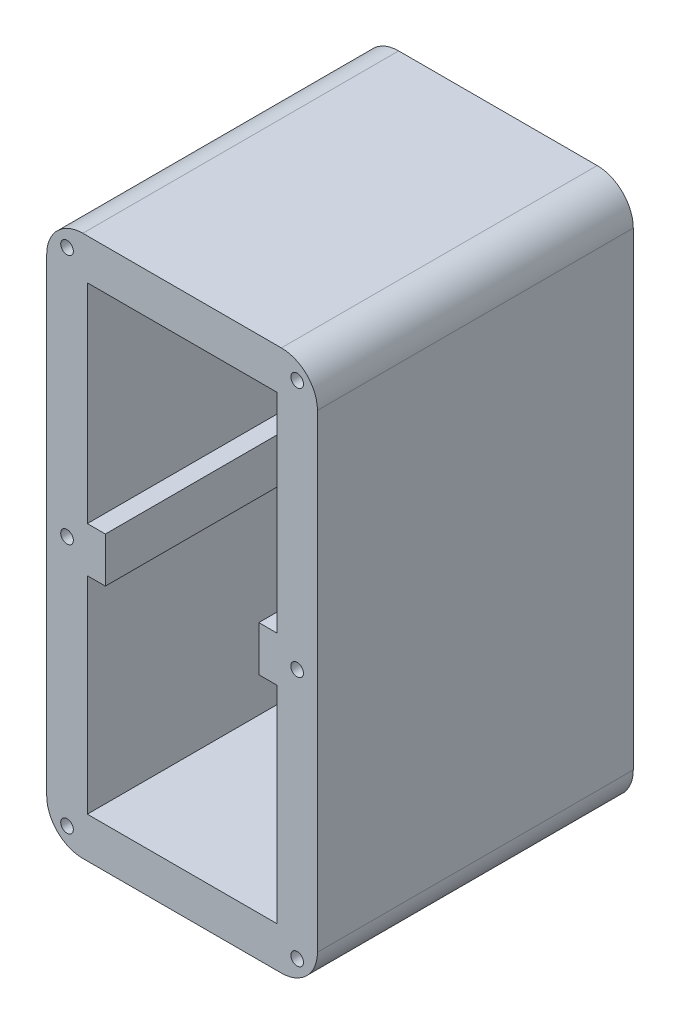
ISO-10303-21;
HEADER;
FILE_DESCRIPTION(('STEP AP214'),'2;1');
FILE_NAME('part.step','',(''),(''),'','','');
FILE_SCHEMA(('AUTOMOTIVE_DESIGN { 1 0 10303 214 1 1 1 1 }'));
ENDSEC;
DATA;
#1=APPLICATION_CONTEXT('core data for automotive mechanical design processes');
#2=APPLICATION_PROTOCOL_DEFINITION('international standard','automotive_design',2000,#1);
#3=PRODUCT_CONTEXT('',#1,'mechanical');
#4=PRODUCT('Part','Part','',(#3));
#5=PRODUCT_RELATED_PRODUCT_CATEGORY('part','',(#4));
#6=PRODUCT_DEFINITION_FORMATION('','',#4);
#7=PRODUCT_DEFINITION_CONTEXT('part definition',#1,'design');
#8=PRODUCT_DEFINITION('design','',#6,#7);
#9=PRODUCT_DEFINITION_SHAPE('','',#8);
#10=(LENGTH_UNIT() NAMED_UNIT(*) SI_UNIT(.MILLI.,.METRE.));
#11=(NAMED_UNIT(*) PLANE_ANGLE_UNIT() SI_UNIT($,.RADIAN.));
#12=(NAMED_UNIT(*) SI_UNIT($,.STERADIAN.) SOLID_ANGLE_UNIT());
#13=UNCERTAINTY_MEASURE_WITH_UNIT(LENGTH_MEASURE(1.E-05),#10,'distance_accuracy_value','');
#14=(GEOMETRIC_REPRESENTATION_CONTEXT(3) GLOBAL_UNCERTAINTY_ASSIGNED_CONTEXT((#13)) GLOBAL_UNIT_ASSIGNED_CONTEXT((#10,
#11,#12)) REPRESENTATION_CONTEXT('',''));
#15=CARTESIAN_POINT('',(0.,0.,0.));
#16=DIRECTION('',(0.,0.,1.));
#17=DIRECTION('',(1.,0.,0.));
#18=AXIS2_PLACEMENT_3D('',#15,#16,#17);
#19=CARTESIAN_POINT('',(-42.5,30.1067415730337,-70.));
#20=DIRECTION('',(0.,0.,1.));
#21=DIRECTION('',(1.,0.,0.));
#22=AXIS2_PLACEMENT_3D('',#19,#20,#21);
#23=CYLINDRICAL_SURFACE('',#22,1.4);
#24=CARTESIAN_POINT('',(-42.5,30.1067415730337,-70.));
#25=DIRECTION('',(0.,0.,1.));
#26=DIRECTION('',(1.,0.,0.));
#27=AXIS2_PLACEMENT_3D('',#24,#25,#26);
#28=CIRCLE('',#27,1.4);
#29=CARTESIAN_POINT('',(-41.1,30.1067415730337,-70.));
#30=VERTEX_POINT('',#29);
#31=EDGE_CURVE('E262',#30,#30,#28,.T.);
#32=ORIENTED_EDGE('',*,*,#31,.F.);
#33=EDGE_LOOP('',(#32));
#34=FACE_BOUND('',#33,.T.);
#35=CARTESIAN_POINT('',(-42.5,30.1067415730337,-62.));
#36=DIRECTION('',(0.,0.,1.));
#37=DIRECTION('',(1.,0.,0.));
#38=AXIS2_PLACEMENT_3D('',#35,#36,#37);
#39=CIRCLE('',#38,1.4);
#40=CARTESIAN_POINT('',(-41.1,30.1067415730337,-62.));
#41=VERTEX_POINT('',#40);
#42=EDGE_CURVE('E336',#41,#41,#39,.F.);
#43=ORIENTED_EDGE('',*,*,#42,.F.);
#44=EDGE_LOOP('',(#43));
#45=FACE_BOUND('',#44,.T.);
#46=ADVANCED_FACE('F39',(#34,#45),#23,.F.);
#47=CARTESIAN_POINT('',(8.50000000000001,30.1067415730337,-70.));
#48=DIRECTION('',(0.,0.,1.));
#49=DIRECTION('',(1.,0.,0.));
#50=AXIS2_PLACEMENT_3D('',#47,#48,#49);
#51=CYLINDRICAL_SURFACE('',#50,1.4);
#52=CARTESIAN_POINT('',(8.50000000000001,30.1067415730337,-70.));
#53=DIRECTION('',(0.,0.,1.));
#54=DIRECTION('',(1.,0.,0.));
#55=AXIS2_PLACEMENT_3D('',#52,#53,#54);
#56=CIRCLE('',#55,1.4);
#57=CARTESIAN_POINT('',(9.90000000000001,30.1067415730337,-70.));
#58=VERTEX_POINT('',#57);
#59=EDGE_CURVE('E265',#58,#58,#56,.T.);
#60=ORIENTED_EDGE('',*,*,#59,.F.);
#61=EDGE_LOOP('',(#60));
#62=FACE_BOUND('',#61,.T.);
#63=CARTESIAN_POINT('',(8.50000000000001,30.1067415730337,-62.));
#64=DIRECTION('',(0.,0.,1.));
#65=DIRECTION('',(1.,0.,0.));
#66=AXIS2_PLACEMENT_3D('',#63,#64,#65);
#67=CIRCLE('',#66,1.4);
#68=CARTESIAN_POINT('',(9.90000000000001,30.1067415730337,-62.));
#69=VERTEX_POINT('',#68);
#70=EDGE_CURVE('E333',#69,#69,#67,.F.);
#71=ORIENTED_EDGE('',*,*,#70,.F.);
#72=EDGE_LOOP('',(#71));
#73=FACE_BOUND('',#72,.T.);
#74=ADVANCED_FACE('F410',(#62,#73),#51,.F.);
#75=CARTESIAN_POINT('',(-42.5,-80.8932584269663,-70.));
#76=DIRECTION('',(0.,0.,1.));
#77=DIRECTION('',(1.,0.,0.));
#78=AXIS2_PLACEMENT_3D('',#75,#76,#77);
#79=CYLINDRICAL_SURFACE('',#78,1.4);
#80=CARTESIAN_POINT('',(-42.5,-80.8932584269663,-70.));
#81=DIRECTION('',(0.,0.,1.));
#82=DIRECTION('',(1.,0.,0.));
#83=AXIS2_PLACEMENT_3D('',#80,#81,#82);
#84=CIRCLE('',#83,1.4);
#85=CARTESIAN_POINT('',(-41.1,-80.8932584269663,-70.));
#86=VERTEX_POINT('',#85);
#87=EDGE_CURVE('E259',#86,#86,#84,.T.);
#88=ORIENTED_EDGE('',*,*,#87,.F.);
#89=EDGE_LOOP('',(#88));
#90=FACE_BOUND('',#89,.T.);
#91=CARTESIAN_POINT('',(-42.5,-80.8932584269663,-62.));
#92=DIRECTION('',(0.,0.,1.));
#93=DIRECTION('',(1.,0.,0.));
#94=AXIS2_PLACEMENT_3D('',#91,#92,#93);
#95=CIRCLE('',#94,1.4);
#96=CARTESIAN_POINT('',(-41.1,-80.8932584269663,-62.));
#97=VERTEX_POINT('',#96);
#98=EDGE_CURVE('E330',#97,#97,#95,.F.);
#99=ORIENTED_EDGE('',*,*,#98,.F.);
#100=EDGE_LOOP('',(#99));
#101=FACE_BOUND('',#100,.T.);
#102=ADVANCED_FACE('F416',(#90,#101),#79,.F.);
#103=CARTESIAN_POINT('',(8.50000000000002,-80.8932584269663,-70.));
#104=DIRECTION('',(0.,0.,1.));
#105=DIRECTION('',(1.,0.,0.));
#106=AXIS2_PLACEMENT_3D('',#103,#104,#105);
#107=CYLINDRICAL_SURFACE('',#106,1.4);
#108=CARTESIAN_POINT('',(8.50000000000002,-80.8932584269663,-70.));
#109=DIRECTION('',(0.,0.,1.));
#110=DIRECTION('',(1.,0.,0.));
#111=AXIS2_PLACEMENT_3D('',#108,#109,#110);
#112=CIRCLE('',#111,1.4);
#113=CARTESIAN_POINT('',(9.90000000000002,-80.8932584269663,-70.));
#114=VERTEX_POINT('',#113);
#115=EDGE_CURVE('E256',#114,#114,#112,.T.);
#116=ORIENTED_EDGE('',*,*,#115,.F.);
#117=EDGE_LOOP('',(#116));
#118=FACE_BOUND('',#117,.T.);
#119=CARTESIAN_POINT('',(8.50000000000002,-80.8932584269663,-62.));
#120=DIRECTION('',(0.,0.,1.));
#121=DIRECTION('',(1.,0.,0.));
#122=AXIS2_PLACEMENT_3D('',#119,#120,#121);
#123=CIRCLE('',#122,1.4);
#124=CARTESIAN_POINT('',(9.90000000000002,-80.8932584269663,-62.));
#125=VERTEX_POINT('',#124);
#126=EDGE_CURVE('E327',#125,#125,#123,.F.);
#127=ORIENTED_EDGE('',*,*,#126,.F.);
#128=EDGE_LOOP('',(#127));
#129=FACE_BOUND('',#128,.T.);
#130=ADVANCED_FACE('F425',(#118,#129),#107,.F.);
#131=CARTESIAN_POINT('',(-42.5,-25.3932584269663,-70.));
#132=DIRECTION('',(0.,0.,1.));
#133=DIRECTION('',(1.,0.,0.));
#134=AXIS2_PLACEMENT_3D('',#131,#132,#133);
#135=CYLINDRICAL_SURFACE('',#134,1.4);
#136=CARTESIAN_POINT('',(-42.5,-25.3932584269663,-70.));
#137=DIRECTION('',(0.,0.,1.));
#138=DIRECTION('',(1.,0.,0.));
#139=AXIS2_PLACEMENT_3D('',#136,#137,#138);
#140=CIRCLE('',#139,1.4);
#141=CARTESIAN_POINT('',(-41.1,-25.3932584269663,-70.));
#142=VERTEX_POINT('',#141);
#143=EDGE_CURVE('E252',#142,#142,#140,.T.);
#144=ORIENTED_EDGE('',*,*,#143,.F.);
#145=EDGE_LOOP('',(#144));
#146=FACE_BOUND('',#145,.T.);
#147=CARTESIAN_POINT('',(-42.5,-25.3932584269663,-62.));
#148=DIRECTION('',(0.,0.,1.));
#149=DIRECTION('',(1.,0.,0.));
#150=AXIS2_PLACEMENT_3D('',#147,#148,#149);
#151=CIRCLE('',#150,1.4);
#152=CARTESIAN_POINT('',(-41.1,-25.3932584269663,-62.));
#153=VERTEX_POINT('',#152);
#154=EDGE_CURVE('E324',#153,#153,#151,.F.);
#155=ORIENTED_EDGE('',*,*,#154,.F.);
#156=EDGE_LOOP('',(#155));
#157=FACE_BOUND('',#156,.T.);
#158=ADVANCED_FACE('F429',(#146,#157),#135,.F.);
#159=CARTESIAN_POINT('',(8.50000000000004,-25.3932584269663,-70.));
#160=DIRECTION('',(0.,0.,1.));
#161=DIRECTION('',(1.,0.,0.));
#162=AXIS2_PLACEMENT_3D('',#159,#160,#161);
#163=CYLINDRICAL_SURFACE('',#162,1.4);
#164=CARTESIAN_POINT('',(8.50000000000004,-25.3932584269663,-70.));
#165=DIRECTION('',(0.,0.,1.));
#166=DIRECTION('',(1.,0.,0.));
#167=AXIS2_PLACEMENT_3D('',#164,#165,#166);
#168=CIRCLE('',#167,1.4);
#169=CARTESIAN_POINT('',(9.90000000000004,-25.3932584269663,-70.));
#170=VERTEX_POINT('',#169);
#171=EDGE_CURVE('E249',#170,#170,#168,.T.);
#172=ORIENTED_EDGE('',*,*,#171,.F.);
#173=EDGE_LOOP('',(#172));
#174=FACE_BOUND('',#173,.T.);
#175=CARTESIAN_POINT('',(8.50000000000004,-25.3932584269663,-62.));
#176=DIRECTION('',(0.,0.,1.));
#177=DIRECTION('',(1.,0.,0.));
#178=AXIS2_PLACEMENT_3D('',#175,#176,#177);
#179=CIRCLE('',#178,1.4);
#180=CARTESIAN_POINT('',(9.90000000000004,-25.3932584269663,-62.));
#181=VERTEX_POINT('',#180);
#182=EDGE_CURVE('E314',#181,#181,#179,.F.);
#183=ORIENTED_EDGE('',*,*,#182,.F.);
#184=EDGE_LOOP('',(#183));
#185=FACE_BOUND('',#184,.T.);
#186=ADVANCED_FACE('F433',(#174,#185),#163,.F.);
#187=CARTESIAN_POINT('',(4.00000000000001,0.,-70.));
#188=DIRECTION('',(1.,0.,0.));
#189=DIRECTION('',(0.,1.,0.));
#190=AXIS2_PLACEMENT_3D('',#187,#188,#189);
#191=PLANE('',#190);
#192=DIRECTION('',(0.,0.,1.));
#193=VECTOR('',#192,1.);
#194=CARTESIAN_POINT('',(4.00000000000001,-20.6188515219815,-60.));
#195=LINE('',#194,#193);
#196=CARTESIAN_POINT('',(4.00000000000001,-20.6188515219815,-60.));
#197=VERTEX_POINT('',#196);
#198=CARTESIAN_POINT('',(4.00000000000001,-20.6188515219815,0.));
#199=VERTEX_POINT('',#198);
#200=EDGE_CURVE('E195',#197,#199,#195,.T.);
#201=ORIENTED_EDGE('',*,*,#200,.T.);
#202=DIRECTION('',(0.,1.,0.));
#203=VECTOR('',#202,1.);
#204=CARTESIAN_POINT('',(4.00000000000001,0.,0.));
#205=LINE('',#204,#203);
#206=CARTESIAN_POINT('',(4.00000000000001,25.6067415730337,0.));
#207=VERTEX_POINT('',#206);
#208=EDGE_CURVE('E240',#199,#207,#205,.T.);
#209=ORIENTED_EDGE('',*,*,#208,.T.);
#210=DIRECTION('',(0.,0.,1.));
#211=VECTOR('',#210,1.);
#212=CARTESIAN_POINT('',(4.00000000000001,25.6067415730337,-70.));
#213=LINE('',#212,#211);
#214=CARTESIAN_POINT('',(4.00000000000001,25.6067415730337,-70.));
#215=VERTEX_POINT('',#214);
#216=EDGE_CURVE('E311',#215,#207,#213,.T.);
#217=ORIENTED_EDGE('',*,*,#216,.F.);
#218=DIRECTION('',(0.,1.,0.));
#219=VECTOR('',#218,1.);
#220=CARTESIAN_POINT('',(4.00000000000001,0.,-70.));
#221=LINE('',#220,#219);
#222=CARTESIAN_POINT('',(4.,-76.3932584269663,-70.));
#223=VERTEX_POINT('',#222);
#224=EDGE_CURVE('E268',#223,#215,#221,.T.);
#225=ORIENTED_EDGE('',*,*,#224,.F.);
#226=DIRECTION('',(0.,0.,1.));
#227=VECTOR('',#226,1.);
#228=CARTESIAN_POINT('',(4.,-76.3932584269663,-70.));
#229=LINE('',#228,#227);
#230=CARTESIAN_POINT('',(4.,-76.3932584269663,0.));
#231=VERTEX_POINT('',#230);
#232=EDGE_CURVE('E289',#223,#231,#229,.T.);
#233=ORIENTED_EDGE('',*,*,#232,.T.);
#234=CARTESIAN_POINT('',(4.00000000000001,-30.6188515219816,0.));
#235=VERTEX_POINT('',#234);
#236=EDGE_CURVE('E290',#231,#235,#205,.T.);
#237=ORIENTED_EDGE('',*,*,#236,.T.);
#238=DIRECTION('',(0.,0.,1.));
#239=VECTOR('',#238,1.);
#240=CARTESIAN_POINT('',(4.00000000000001,-30.6188515219816,-60.));
#241=LINE('',#240,#239);
#242=CARTESIAN_POINT('',(4.00000000000001,-30.6188515219816,-60.));
#243=VERTEX_POINT('',#242);
#244=EDGE_CURVE('E217',#243,#235,#241,.T.);
#245=ORIENTED_EDGE('',*,*,#244,.F.);
#246=DIRECTION('',(0.,1.,0.));
#247=VECTOR('',#246,1.);
#248=CARTESIAN_POINT('',(4.00000000000001,0.,-60.));
#249=LINE('',#248,#247);
#250=EDGE_CURVE('E188',#243,#197,#249,.T.);
#251=ORIENTED_EDGE('',*,*,#250,.T.);
#252=EDGE_LOOP('',(#201,#209,#217,#225,#233,#237,#245,#251));
#253=FACE_BOUND('',#252,.T.);
#254=ADVANCED_FACE('F436',(#253),#191,.F.);
#255=CARTESIAN_POINT('',(13.,0.,-70.));
#256=DIRECTION('',(-1.,0.,0.));
#257=DIRECTION('',(0.,-1.,0.));
#258=AXIS2_PLACEMENT_3D('',#255,#256,#257);
#259=PLANE('',#258);
#260=DIRECTION('',(0.,-1.,0.));
#261=VECTOR('',#260,1.);
#262=CARTESIAN_POINT('',(13.,0.,0.));
#263=LINE('',#262,#261);
#264=CARTESIAN_POINT('',(13.,26.6067415730337,0.));
#265=VERTEX_POINT('',#264);
#266=CARTESIAN_POINT('',(13.,-77.3932584269663,0.));
#267=VERTEX_POINT('',#266);
#268=EDGE_CURVE('E301',#265,#267,#263,.T.);
#269=ORIENTED_EDGE('',*,*,#268,.T.);
#270=DIRECTION('',(0.,0.,1.));
#271=VECTOR('',#270,1.);
#272=CARTESIAN_POINT('',(13.,-77.3932584269663,-70.));
#273=LINE('',#272,#271);
#274=CARTESIAN_POINT('',(13.,-77.3932584269663,-70.));
#275=VERTEX_POINT('',#274);
#276=EDGE_CURVE('E355',#267,#275,#273,.F.);
#277=ORIENTED_EDGE('',*,*,#276,.T.);
#278=DIRECTION('',(0.,-1.,0.));
#279=VECTOR('',#278,1.);
#280=CARTESIAN_POINT('',(13.,0.,-70.));
#281=LINE('',#280,#279);
#282=CARTESIAN_POINT('',(13.,26.6067415730337,-70.));
#283=VERTEX_POINT('',#282);
#284=EDGE_CURVE('E278',#283,#275,#281,.T.);
#285=ORIENTED_EDGE('',*,*,#284,.F.);
#286=DIRECTION('',(0.,0.,1.));
#287=VECTOR('',#286,1.);
#288=CARTESIAN_POINT('',(13.,26.6067415730337,-70.));
#289=LINE('',#288,#287);
#290=EDGE_CURVE('E352',#283,#265,#289,.T.);
#291=ORIENTED_EDGE('',*,*,#290,.T.);
#292=EDGE_LOOP('',(#269,#277,#285,#291));
#293=FACE_BOUND('',#292,.T.);
#294=ADVANCED_FACE('F390',(#293),#259,.F.);
#295=CARTESIAN_POINT('',(0.,-85.3932584269663,-70.));
#296=DIRECTION('',(0.,-1.,0.));
#297=DIRECTION('',(0.,0.,-1.));
#298=AXIS2_PLACEMENT_3D('',#295,#296,#297);
#299=PLANE('',#298);
#300=DIRECTION('',(1.,0.,0.));
#301=VECTOR('',#300,1.);
#302=CARTESIAN_POINT('',(0.,-85.3932584269663,-70.));
#303=LINE('',#302,#301);
#304=CARTESIAN_POINT('',(-39.,-85.3932584269663,-70.));
#305=VERTEX_POINT('',#304);
#306=CARTESIAN_POINT('',(5.00000000000002,-85.3932584269663,-70.));
#307=VERTEX_POINT('',#306);
#308=EDGE_CURVE('E286',#305,#307,#303,.T.);
#309=ORIENTED_EDGE('',*,*,#308,.T.);
#310=DIRECTION('',(0.,0.,1.));
#311=VECTOR('',#310,1.);
#312=CARTESIAN_POINT('',(5.00000000000002,-85.3932584269663,0.));
#313=LINE('',#312,#311);
#314=CARTESIAN_POINT('',(5.00000000000002,-85.3932584269663,0.));
#315=VERTEX_POINT('',#314);
#316=EDGE_CURVE('E341',#307,#315,#313,.T.);
#317=ORIENTED_EDGE('',*,*,#316,.T.);
#318=DIRECTION('',(1.,0.,0.));
#319=VECTOR('',#318,1.);
#320=CARTESIAN_POINT('',(0.,-85.3932584269663,0.));
#321=LINE('',#320,#319);
#322=CARTESIAN_POINT('',(-39.,-85.3932584269663,0.));
#323=VERTEX_POINT('',#322);
#324=EDGE_CURVE('E253',#323,#315,#321,.T.);
#325=ORIENTED_EDGE('',*,*,#324,.F.);
#326=DIRECTION('',(0.,0.,1.));
#327=VECTOR('',#326,1.);
#328=CARTESIAN_POINT('',(-39.,-85.3932584269663,-70.));
#329=LINE('',#328,#327);
#330=EDGE_CURVE('E339',#323,#305,#329,.F.);
#331=ORIENTED_EDGE('',*,*,#330,.T.);
#332=EDGE_LOOP('',(#309,#317,#325,#331));
#333=FACE_BOUND('',#332,.T.);
#334=ADVANCED_FACE('F397',(#333),#299,.T.);
#335=CARTESIAN_POINT('',(-47.,0.,-70.));
#336=DIRECTION('',(-1.,0.,0.));
#337=DIRECTION('',(0.,-1.,0.));
#338=AXIS2_PLACEMENT_3D('',#335,#336,#337);
#339=PLANE('',#338);
#340=DIRECTION('',(0.,-1.,0.));
#341=VECTOR('',#340,1.);
#342=CARTESIAN_POINT('',(-47.,0.,-70.));
#343=LINE('',#342,#341);
#344=CARTESIAN_POINT('',(-47.,26.6067415730337,-70.));
#345=VERTEX_POINT('',#344);
#346=CARTESIAN_POINT('',(-47.,-77.3932584269663,-70.));
#347=VERTEX_POINT('',#346);
#348=EDGE_CURVE('E283',#345,#347,#343,.T.);
#349=ORIENTED_EDGE('',*,*,#348,.T.);
#350=DIRECTION('',(0.,0.,1.));
#351=VECTOR('',#350,1.);
#352=CARTESIAN_POINT('',(-47.,-77.3932584269663,-70.));
#353=LINE('',#352,#351);
#354=CARTESIAN_POINT('',(-47.,-77.3932584269663,0.));
#355=VERTEX_POINT('',#354);
#356=EDGE_CURVE('E366',#347,#355,#353,.T.);
#357=ORIENTED_EDGE('',*,*,#356,.T.);
#358=DIRECTION('',(0.,-1.,0.));
#359=VECTOR('',#358,1.);
#360=CARTESIAN_POINT('',(-47.,0.,0.));
#361=LINE('',#360,#359);
#362=CARTESIAN_POINT('',(-47.,26.6067415730337,0.));
#363=VERTEX_POINT('',#362);
#364=EDGE_CURVE('E306',#363,#355,#361,.T.);
#365=ORIENTED_EDGE('',*,*,#364,.F.);
#366=DIRECTION('',(0.,0.,1.));
#367=VECTOR('',#366,1.);
#368=CARTESIAN_POINT('',(-47.,26.6067415730337,-70.));
#369=LINE('',#368,#367);
#370=EDGE_CURVE('E364',#363,#345,#369,.F.);
#371=ORIENTED_EDGE('',*,*,#370,.T.);
#372=EDGE_LOOP('',(#349,#357,#365,#371));
#373=FACE_BOUND('',#372,.T.);
#374=ADVANCED_FACE('F371',(#373),#339,.T.);
#375=CARTESIAN_POINT('',(0.,25.6067415730337,-70.));
#376=DIRECTION('',(0.,-1.,0.));
#377=DIRECTION('',(0.,0.,-1.));
#378=AXIS2_PLACEMENT_3D('',#375,#376,#377);
#379=PLANE('',#378);
#380=DIRECTION('',(1.,0.,0.));
#381=VECTOR('',#380,1.);
#382=CARTESIAN_POINT('',(0.,25.6067415730337,0.));
#383=LINE('',#382,#381);
#384=CARTESIAN_POINT('',(-38.,25.6067415730337,0.));
#385=VERTEX_POINT('',#384);
#386=EDGE_CURVE('E298',#385,#207,#383,.T.);
#387=ORIENTED_EDGE('',*,*,#386,.F.);
#388=DIRECTION('',(0.,0.,1.));
#389=VECTOR('',#388,1.);
#390=CARTESIAN_POINT('',(-38.,25.6067415730337,-70.));
#391=LINE('',#390,#389);
#392=CARTESIAN_POINT('',(-38.,25.6067415730337,-70.));
#393=VERTEX_POINT('',#392);
#394=EDGE_CURVE('E315',#393,#385,#391,.T.);
#395=ORIENTED_EDGE('',*,*,#394,.F.);
#396=DIRECTION('',(1.,0.,0.));
#397=VECTOR('',#396,1.);
#398=CARTESIAN_POINT('',(0.,25.6067415730337,-70.));
#399=LINE('',#398,#397);
#400=EDGE_CURVE('E275',#393,#215,#399,.T.);
#401=ORIENTED_EDGE('',*,*,#400,.T.);
#402=ORIENTED_EDGE('',*,*,#216,.T.);
#403=EDGE_LOOP('',(#387,#395,#401,#402));
#404=FACE_BOUND('',#403,.T.);
#405=ADVANCED_FACE('F494',(#404),#379,.T.);
#406=CARTESIAN_POINT('',(-38.,0.,-70.));
#407=DIRECTION('',(1.,0.,0.));
#408=DIRECTION('',(0.,0.,-1.));
#409=AXIS2_PLACEMENT_3D('',#406,#407,#408);
#410=PLANE('',#409);
#411=DIRECTION('',(0.,0.,1.));
#412=VECTOR('',#411,1.);
#413=CARTESIAN_POINT('',(-38.,-30.6188515219816,-60.));
#414=LINE('',#413,#412);
#415=CARTESIAN_POINT('',(-38.,-30.6188515219816,-60.));
#416=VERTEX_POINT('',#415);
#417=CARTESIAN_POINT('',(-38.,-30.6188515219816,0.));
#418=VERTEX_POINT('',#417);
#419=EDGE_CURVE('E241',#416,#418,#414,.T.);
#420=ORIENTED_EDGE('',*,*,#419,.T.);
#421=DIRECTION('',(0.,1.,0.));
#422=VECTOR('',#421,1.);
#423=CARTESIAN_POINT('',(-38.,0.,0.));
#424=LINE('',#423,#422);
#425=CARTESIAN_POINT('',(-38.,-76.3932584269663,0.));
#426=VERTEX_POINT('',#425);
#427=EDGE_CURVE('E295',#426,#418,#424,.T.);
#428=ORIENTED_EDGE('',*,*,#427,.F.);
#429=DIRECTION('',(0.,0.,1.));
#430=VECTOR('',#429,1.);
#431=CARTESIAN_POINT('',(-38.,-76.3932584269663,-70.));
#432=LINE('',#431,#430);
#433=CARTESIAN_POINT('',(-38.,-76.3932584269663,-70.));
#434=VERTEX_POINT('',#433);
#435=EDGE_CURVE('E318',#434,#426,#432,.T.);
#436=ORIENTED_EDGE('',*,*,#435,.F.);
#437=DIRECTION('',(0.,1.,0.));
#438=VECTOR('',#437,1.);
#439=CARTESIAN_POINT('',(-38.,0.,-70.));
#440=LINE('',#439,#438);
#441=EDGE_CURVE('E272',#434,#393,#440,.T.);
#442=ORIENTED_EDGE('',*,*,#441,.T.);
#443=ORIENTED_EDGE('',*,*,#394,.T.);
#444=CARTESIAN_POINT('',(-38.,-20.6188515219816,0.));
#445=VERTEX_POINT('',#444);
#446=EDGE_CURVE('E294',#445,#385,#424,.T.);
#447=ORIENTED_EDGE('',*,*,#446,.F.);
#448=DIRECTION('',(0.,0.,1.));
#449=VECTOR('',#448,1.);
#450=CARTESIAN_POINT('',(-38.,-20.6188515219816,-60.));
#451=LINE('',#450,#449);
#452=CARTESIAN_POINT('',(-38.,-20.6188515219816,-60.));
#453=VERTEX_POINT('',#452);
#454=EDGE_CURVE('E244',#453,#445,#451,.T.);
#455=ORIENTED_EDGE('',*,*,#454,.F.);
#456=DIRECTION('',(0.,1.,0.));
#457=VECTOR('',#456,1.);
#458=CARTESIAN_POINT('',(-38.,0.,-60.));
#459=LINE('',#458,#457);
#460=EDGE_CURVE('E226',#416,#453,#459,.T.);
#461=ORIENTED_EDGE('',*,*,#460,.F.);
#462=EDGE_LOOP('',(#420,#428,#436,#442,#443,#447,#455,#461));
#463=FACE_BOUND('',#462,.T.);
#464=ADVANCED_FACE('F502',(#463),#410,.T.);
#465=CARTESIAN_POINT('',(0.,-76.3932584269663,-70.));
#466=DIRECTION('',(0.,-1.,0.));
#467=DIRECTION('',(0.,0.,-1.));
#468=AXIS2_PLACEMENT_3D('',#465,#466,#467);
#469=PLANE('',#468);
#470=DIRECTION('',(1.,0.,0.));
#471=VECTOR('',#470,1.);
#472=CARTESIAN_POINT('',(0.,-76.3932584269663,0.));
#473=LINE('',#472,#471);
#474=EDGE_CURVE('E292',#426,#231,#473,.T.);
#475=ORIENTED_EDGE('',*,*,#474,.T.);
#476=ORIENTED_EDGE('',*,*,#232,.F.);
#477=DIRECTION('',(1.,0.,0.));
#478=VECTOR('',#477,1.);
#479=CARTESIAN_POINT('',(0.,-76.3932584269663,-70.));
#480=LINE('',#479,#478);
#481=EDGE_CURVE('E270',#434,#223,#480,.T.);
#482=ORIENTED_EDGE('',*,*,#481,.F.);
#483=ORIENTED_EDGE('',*,*,#435,.T.);
#484=EDGE_LOOP('',(#475,#476,#482,#483));
#485=FACE_BOUND('',#484,.T.);
#486=ADVANCED_FACE('F497',(#485),#469,.F.);
#487=CARTESIAN_POINT('',(0.,34.6067415730337,-70.));
#488=DIRECTION('',(0.,-1.,0.));
#489=DIRECTION('',(1.,0.,0.));
#490=AXIS2_PLACEMENT_3D('',#487,#488,#489);
#491=PLANE('',#490);
#492=DIRECTION('',(1.,0.,0.));
#493=VECTOR('',#492,1.);
#494=CARTESIAN_POINT('',(0.,34.6067415730337,-70.));
#495=LINE('',#494,#493);
#496=CARTESIAN_POINT('',(-39.,34.6067415730337,-70.));
#497=VERTEX_POINT('',#496);
#498=CARTESIAN_POINT('',(5.00000000000001,34.6067415730337,-70.));
#499=VERTEX_POINT('',#498);
#500=EDGE_CURVE('E281',#497,#499,#495,.T.);
#501=ORIENTED_EDGE('',*,*,#500,.F.);
#502=DIRECTION('',(0.,0.,1.));
#503=VECTOR('',#502,1.);
#504=CARTESIAN_POINT('',(-39.,34.6067415730337,0.));
#505=LINE('',#504,#503);
#506=CARTESIAN_POINT('',(-39.,34.6067415730337,0.));
#507=VERTEX_POINT('',#506);
#508=EDGE_CURVE('E11',#497,#507,#505,.T.);
#509=ORIENTED_EDGE('',*,*,#508,.T.);
#510=DIRECTION('',(1.,0.,0.));
#511=VECTOR('',#510,1.);
#512=CARTESIAN_POINT('',(0.,34.6067415730337,0.));
#513=LINE('',#512,#511);
#514=CARTESIAN_POINT('',(5.00000000000001,34.6067415730337,0.));
#515=VERTEX_POINT('',#514);
#516=EDGE_CURVE('E304',#507,#515,#513,.T.);
#517=ORIENTED_EDGE('',*,*,#516,.T.);
#518=DIRECTION('',(0.,0.,1.));
#519=VECTOR('',#518,1.);
#520=CARTESIAN_POINT('',(5.00000000000001,34.6067415730337,-70.));
#521=LINE('',#520,#519);
#522=EDGE_CURVE('E47',#515,#499,#521,.F.);
#523=ORIENTED_EDGE('',*,*,#522,.T.);
#524=EDGE_LOOP('',(#501,#509,#517,#523));
#525=FACE_BOUND('',#524,.T.);
#526=ADVANCED_FACE('F382',(#525),#491,.F.);
#527=CARTESIAN_POINT('',(0.,0.,-70.));
#528=DIRECTION('',(0.,0.,1.));
#529=DIRECTION('',(1.,0.,0.));
#530=AXIS2_PLACEMENT_3D('',#527,#528,#529);
#531=PLANE('',#530);
#532=ORIENTED_EDGE('',*,*,#171,.T.);
#533=EDGE_LOOP('',(#532));
#534=FACE_BOUND('',#533,.T.);
#535=ORIENTED_EDGE('',*,*,#143,.T.);
#536=EDGE_LOOP('',(#535));
#537=FACE_BOUND('',#536,.T.);
#538=ORIENTED_EDGE('',*,*,#115,.T.);
#539=EDGE_LOOP('',(#538));
#540=FACE_BOUND('',#539,.T.);
#541=ORIENTED_EDGE('',*,*,#87,.T.);
#542=EDGE_LOOP('',(#541));
#543=FACE_BOUND('',#542,.T.);
#544=ORIENTED_EDGE('',*,*,#31,.T.);
#545=EDGE_LOOP('',(#544));
#546=FACE_BOUND('',#545,.T.);
#547=ORIENTED_EDGE('',*,*,#59,.T.);
#548=EDGE_LOOP('',(#547));
#549=FACE_BOUND('',#548,.T.);
#550=ORIENTED_EDGE('',*,*,#224,.T.);
#551=ORIENTED_EDGE('',*,*,#400,.F.);
#552=ORIENTED_EDGE('',*,*,#441,.F.);
#553=ORIENTED_EDGE('',*,*,#481,.T.);
#554=EDGE_LOOP('',(#550,#551,#552,#553));
#555=FACE_BOUND('',#554,.T.);
#556=ORIENTED_EDGE('',*,*,#284,.T.);
#557=CARTESIAN_POINT('',(5.00000000000002,-77.3932584269663,-70.));
#558=DIRECTION('',(0.,0.,1.));
#559=DIRECTION('',(1.,0.,0.));
#560=AXIS2_PLACEMENT_3D('',#557,#558,#559);
#561=CIRCLE('',#560,8.);
#562=EDGE_CURVE('E362',#275,#307,#561,.F.);
#563=ORIENTED_EDGE('',*,*,#562,.T.);
#564=ORIENTED_EDGE('',*,*,#308,.F.);
#565=CARTESIAN_POINT('',(-39.,-77.3932584269663,-70.));
#566=DIRECTION('',(0.,0.,1.));
#567=DIRECTION('',(1.,0.,0.));
#568=AXIS2_PLACEMENT_3D('',#565,#566,#567);
#569=CIRCLE('',#568,8.);
#570=EDGE_CURVE('E360',#305,#347,#569,.F.);
#571=ORIENTED_EDGE('',*,*,#570,.T.);
#572=ORIENTED_EDGE('',*,*,#348,.F.);
#573=CARTESIAN_POINT('',(-39.,26.6067415730337,-70.));
#574=DIRECTION('',(0.,0.,1.));
#575=DIRECTION('',(1.,0.,0.));
#576=AXIS2_PLACEMENT_3D('',#573,#574,#575);
#577=CIRCLE('',#576,8.);
#578=EDGE_CURVE('E60',#345,#497,#577,.F.);
#579=ORIENTED_EDGE('',*,*,#578,.T.);
#580=ORIENTED_EDGE('',*,*,#500,.T.);
#581=CARTESIAN_POINT('',(5.00000000000001,26.6067415730337,-70.));
#582=DIRECTION('',(0.,0.,1.));
#583=DIRECTION('',(1.,0.,0.));
#584=AXIS2_PLACEMENT_3D('',#581,#582,#583);
#585=CIRCLE('',#584,8.);
#586=EDGE_CURVE('E357',#499,#283,#585,.F.);
#587=ORIENTED_EDGE('',*,*,#586,.T.);
#588=EDGE_LOOP('',(#556,#563,#564,#571,#572,#579,#580,#587));
#589=FACE_BOUND('',#588,.T.);
#590=ADVANCED_FACE('F384',(#534,#537,#540,#543,#546,#549,#555,#589),#531,.F.);
#591=CARTESIAN_POINT('',(0.,0.,0.));
#592=DIRECTION('',(0.,0.,1.));
#593=DIRECTION('',(1.,0.,0.));
#594=AXIS2_PLACEMENT_3D('',#591,#592,#593);
#595=PLANE('',#594);
#596=CARTESIAN_POINT('',(8.50000000000002,-80.8932584269663,0.));
#597=DIRECTION('',(0.,0.,1.));
#598=DIRECTION('',(1.,0.,0.));
#599=AXIS2_PLACEMENT_3D('',#596,#597,#598);
#600=CIRCLE('',#599,1.4);
#601=CARTESIAN_POINT('',(9.90000000000002,-80.8932584269663,0.));
#602=VERTEX_POINT('',#601);
#603=EDGE_CURVE('E980',#602,#602,#600,.T.);
#604=ORIENTED_EDGE('',*,*,#603,.F.);
#605=EDGE_LOOP('',(#604));
#606=FACE_BOUND('',#605,.T.);
#607=CARTESIAN_POINT('',(-42.5,30.1067415730337,0.));
#608=DIRECTION('',(0.,0.,1.));
#609=DIRECTION('',(1.,0.,0.));
#610=AXIS2_PLACEMENT_3D('',#607,#608,#609);
#611=CIRCLE('',#610,1.4);
#612=CARTESIAN_POINT('',(-41.1,30.1067415730337,0.));
#613=VERTEX_POINT('',#612);
#614=EDGE_CURVE('E1004',#613,#613,#611,.T.);
#615=ORIENTED_EDGE('',*,*,#614,.F.);
#616=EDGE_LOOP('',(#615));
#617=FACE_BOUND('',#616,.T.);
#618=CARTESIAN_POINT('',(8.50000000000001,30.1067415730337,0.));
#619=DIRECTION('',(0.,0.,1.));
#620=DIRECTION('',(1.,0.,0.));
#621=AXIS2_PLACEMENT_3D('',#618,#619,#620);
#622=CIRCLE('',#621,1.4);
#623=CARTESIAN_POINT('',(9.90000000000001,30.1067415730337,0.));
#624=VERTEX_POINT('',#623);
#625=EDGE_CURVE('E998',#624,#624,#622,.T.);
#626=ORIENTED_EDGE('',*,*,#625,.F.);
#627=EDGE_LOOP('',(#626));
#628=FACE_BOUND('',#627,.T.);
#629=CARTESIAN_POINT('',(8.50000000000004,-25.3932584269663,0.));
#630=DIRECTION('',(0.,0.,1.));
#631=DIRECTION('',(1.,0.,0.));
#632=AXIS2_PLACEMENT_3D('',#629,#630,#631);
#633=CIRCLE('',#632,1.4);
#634=CARTESIAN_POINT('',(9.90000000000004,-25.3932584269663,0.));
#635=VERTEX_POINT('',#634);
#636=EDGE_CURVE('E991',#635,#635,#633,.T.);
#637=ORIENTED_EDGE('',*,*,#636,.F.);
#638=EDGE_LOOP('',(#637));
#639=FACE_BOUND('',#638,.T.);
#640=CARTESIAN_POINT('',(-42.5,-80.8932584269663,0.));
#641=DIRECTION('',(0.,0.,1.));
#642=DIRECTION('',(1.,0.,0.));
#643=AXIS2_PLACEMENT_3D('',#640,#641,#642);
#644=CIRCLE('',#643,1.4);
#645=CARTESIAN_POINT('',(-41.1,-80.8932584269663,0.));
#646=VERTEX_POINT('',#645);
#647=EDGE_CURVE('E981',#646,#646,#644,.T.);
#648=ORIENTED_EDGE('',*,*,#647,.F.);
#649=EDGE_LOOP('',(#648));
#650=FACE_BOUND('',#649,.T.);
#651=CARTESIAN_POINT('',(-42.5,-25.3932584269663,0.));
#652=DIRECTION('',(0.,0.,1.));
#653=DIRECTION('',(1.,0.,0.));
#654=AXIS2_PLACEMENT_3D('',#651,#652,#653);
#655=CIRCLE('',#654,1.4);
#656=CARTESIAN_POINT('',(-41.1,-25.3932584269663,0.));
#657=VERTEX_POINT('',#656);
#658=EDGE_CURVE('E994',#657,#657,#655,.T.);
#659=ORIENTED_EDGE('',*,*,#658,.F.);
#660=EDGE_LOOP('',(#659));
#661=FACE_BOUND('',#660,.T.);
#662=ORIENTED_EDGE('',*,*,#236,.F.);
#663=ORIENTED_EDGE('',*,*,#474,.F.);
#664=ORIENTED_EDGE('',*,*,#427,.T.);
#665=DIRECTION('',(1.,0.,0.));
#666=VECTOR('',#665,1.);
#667=CARTESIAN_POINT('',(0.,-30.6188515219816,0.));
#668=LINE('',#667,#666);
#669=CARTESIAN_POINT('',(-34.,-30.6188515219816,0.));
#670=VERTEX_POINT('',#669);
#671=EDGE_CURVE('E224',#418,#670,#668,.T.);
#672=ORIENTED_EDGE('',*,*,#671,.T.);
#673=DIRECTION('',(0.,-1.,0.));
#674=VECTOR('',#673,1.);
#675=CARTESIAN_POINT('',(-34.,0.,0.));
#676=LINE('',#675,#674);
#677=CARTESIAN_POINT('',(-34.,-20.6188515219816,0.));
#678=VERTEX_POINT('',#677);
#679=EDGE_CURVE('E216',#678,#670,#676,.T.);
#680=ORIENTED_EDGE('',*,*,#679,.F.);
#681=DIRECTION('',(1.,0.,0.));
#682=VECTOR('',#681,1.);
#683=CARTESIAN_POINT('',(0.,-20.6188515219816,0.));
#684=LINE('',#683,#682);
#685=EDGE_CURVE('E234',#445,#678,#684,.T.);
#686=ORIENTED_EDGE('',*,*,#685,.F.);
#687=ORIENTED_EDGE('',*,*,#446,.T.);
#688=ORIENTED_EDGE('',*,*,#386,.T.);
#689=ORIENTED_EDGE('',*,*,#208,.F.);
#690=DIRECTION('',(1.,0.,0.));
#691=VECTOR('',#690,1.);
#692=CARTESIAN_POINT('',(0.,-20.6188515219815,0.));
#693=LINE('',#692,#691);
#694=CARTESIAN_POINT('',(0.,-20.6188515219815,0.));
#695=VERTEX_POINT('',#694);
#696=EDGE_CURVE('E209',#695,#199,#693,.T.);
#697=ORIENTED_EDGE('',*,*,#696,.F.);
#698=DIRECTION('',(0.,-1.,0.));
#699=VECTOR('',#698,1.);
#700=CARTESIAN_POINT('',(0.,0.,0.));
#701=LINE('',#700,#699);
#702=CARTESIAN_POINT('',(0.,-30.6188515219815,0.));
#703=VERTEX_POINT('',#702);
#704=EDGE_CURVE('E183',#695,#703,#701,.T.);
#705=ORIENTED_EDGE('',*,*,#704,.T.);
#706=DIRECTION('',(1.,0.,0.));
#707=VECTOR('',#706,1.);
#708=CARTESIAN_POINT('',(-1.06230481085259E-13,-30.6188515219815,0.));
#709=LINE('',#708,#707);
#710=EDGE_CURVE('E198',#703,#235,#709,.T.);
#711=ORIENTED_EDGE('',*,*,#710,.T.);
#712=EDGE_LOOP('',(#662,#663,#664,#672,#680,#686,#687,#688,#689,#697,#705,#711));
#713=FACE_BOUND('',#712,.T.);
#714=ORIENTED_EDGE('',*,*,#324,.T.);
#715=CARTESIAN_POINT('',(5.00000000000002,-77.3932584269663,0.));
#716=DIRECTION('',(0.,0.,1.));
#717=DIRECTION('',(1.,0.,0.));
#718=AXIS2_PLACEMENT_3D('',#715,#716,#717);
#719=CIRCLE('',#718,8.);
#720=EDGE_CURVE('E350',#315,#267,#719,.T.);
#721=ORIENTED_EDGE('',*,*,#720,.T.);
#722=ORIENTED_EDGE('',*,*,#268,.F.);
#723=CARTESIAN_POINT('',(5.00000000000001,26.6067415730337,0.));
#724=DIRECTION('',(0.,0.,1.));
#725=DIRECTION('',(1.,0.,0.));
#726=AXIS2_PLACEMENT_3D('',#723,#724,#725);
#727=CIRCLE('',#726,8.);
#728=EDGE_CURVE('E344',#265,#515,#727,.T.);
#729=ORIENTED_EDGE('',*,*,#728,.T.);
#730=ORIENTED_EDGE('',*,*,#516,.F.);
#731=CARTESIAN_POINT('',(-39.,26.6067415730337,0.));
#732=DIRECTION('',(0.,0.,1.));
#733=DIRECTION('',(1.,0.,0.));
#734=AXIS2_PLACEMENT_3D('',#731,#732,#733);
#735=CIRCLE('',#734,8.);
#736=EDGE_CURVE('E346',#507,#363,#735,.T.);
#737=ORIENTED_EDGE('',*,*,#736,.T.);
#738=ORIENTED_EDGE('',*,*,#364,.T.);
#739=CARTESIAN_POINT('',(-39.,-77.3932584269663,0.));
#740=DIRECTION('',(0.,0.,1.));
#741=DIRECTION('',(1.,0.,0.));
#742=AXIS2_PLACEMENT_3D('',#739,#740,#741);
#743=CIRCLE('',#742,8.);
#744=EDGE_CURVE('E348',#355,#323,#743,.T.);
#745=ORIENTED_EDGE('',*,*,#744,.T.);
#746=EDGE_LOOP('',(#714,#721,#722,#729,#730,#737,#738,#745));
#747=FACE_BOUND('',#746,.T.);
#748=ADVANCED_FACE('F376',(#606,#617,#628,#639,#650,#661,#713,#747),#595,.T.);
#749=CARTESIAN_POINT('',(-34.,0.,-60.));
#750=DIRECTION('',(-1.,0.,0.));
#751=DIRECTION('',(0.,0.,1.));
#752=AXIS2_PLACEMENT_3D('',#749,#750,#751);
#753=PLANE('',#752);
#754=ORIENTED_EDGE('',*,*,#679,.T.);
#755=DIRECTION('',(0.,0.,1.));
#756=VECTOR('',#755,1.);
#757=CARTESIAN_POINT('',(-34.,-30.6188515219816,-60.));
#758=LINE('',#757,#756);
#759=CARTESIAN_POINT('',(-34.,-30.6188515219816,-60.));
#760=VERTEX_POINT('',#759);
#761=EDGE_CURVE('E238',#760,#670,#758,.T.);
#762=ORIENTED_EDGE('',*,*,#761,.F.);
#763=DIRECTION('',(0.,-1.,0.));
#764=VECTOR('',#763,1.);
#765=CARTESIAN_POINT('',(-34.,0.,-60.));
#766=LINE('',#765,#764);
#767=CARTESIAN_POINT('',(-34.,-20.6188515219816,-60.));
#768=VERTEX_POINT('',#767);
#769=EDGE_CURVE('E221',#768,#760,#766,.T.);
#770=ORIENTED_EDGE('',*,*,#769,.F.);
#771=DIRECTION('',(0.,0.,1.));
#772=VECTOR('',#771,1.);
#773=CARTESIAN_POINT('',(-34.,-20.6188515219816,-60.));
#774=LINE('',#773,#772);
#775=EDGE_CURVE('E231',#768,#678,#774,.T.);
#776=ORIENTED_EDGE('',*,*,#775,.T.);
#777=EDGE_LOOP('',(#754,#762,#770,#776));
#778=FACE_BOUND('',#777,.T.);
#779=ADVANCED_FACE('F476',(#778),#753,.F.);
#780=CARTESIAN_POINT('',(0.,-30.6188515219816,-60.));
#781=DIRECTION('',(0.,-1.,0.));
#782=DIRECTION('',(0.,0.,-1.));
#783=AXIS2_PLACEMENT_3D('',#780,#781,#782);
#784=PLANE('',#783);
#785=ORIENTED_EDGE('',*,*,#671,.F.);
#786=ORIENTED_EDGE('',*,*,#419,.F.);
#787=DIRECTION('',(1.,0.,0.));
#788=VECTOR('',#787,1.);
#789=CARTESIAN_POINT('',(0.,-30.6188515219816,-60.));
#790=LINE('',#789,#788);
#791=EDGE_CURVE('E228',#416,#760,#790,.T.);
#792=ORIENTED_EDGE('',*,*,#791,.T.);
#793=ORIENTED_EDGE('',*,*,#761,.T.);
#794=EDGE_LOOP('',(#785,#786,#792,#793));
#795=FACE_BOUND('',#794,.T.);
#796=ADVANCED_FACE('F473',(#795),#784,.T.);
#797=CARTESIAN_POINT('',(0.,-20.6188515219816,-60.));
#798=DIRECTION('',(0.,-1.,0.));
#799=DIRECTION('',(0.,0.,-1.));
#800=AXIS2_PLACEMENT_3D('',#797,#798,#799);
#801=PLANE('',#800);
#802=ORIENTED_EDGE('',*,*,#685,.T.);
#803=ORIENTED_EDGE('',*,*,#775,.F.);
#804=DIRECTION('',(1.,0.,0.));
#805=VECTOR('',#804,1.);
#806=CARTESIAN_POINT('',(0.,-20.6188515219816,-60.));
#807=LINE('',#806,#805);
#808=EDGE_CURVE('E223',#453,#768,#807,.T.);
#809=ORIENTED_EDGE('',*,*,#808,.F.);
#810=ORIENTED_EDGE('',*,*,#454,.T.);
#811=EDGE_LOOP('',(#802,#803,#809,#810));
#812=FACE_BOUND('',#811,.T.);
#813=ADVANCED_FACE('F471',(#812),#801,.F.);
#814=CARTESIAN_POINT('',(0.,0.,-60.));
#815=DIRECTION('',(0.,0.,1.));
#816=DIRECTION('',(1.,0.,0.));
#817=AXIS2_PLACEMENT_3D('',#814,#815,#816);
#818=PLANE('',#817);
#819=ORIENTED_EDGE('',*,*,#769,.T.);
#820=ORIENTED_EDGE('',*,*,#791,.F.);
#821=ORIENTED_EDGE('',*,*,#460,.T.);
#822=ORIENTED_EDGE('',*,*,#808,.T.);
#823=EDGE_LOOP('',(#819,#820,#821,#822));
#824=FACE_BOUND('',#823,.T.);
#825=ADVANCED_FACE('F468',(#824),#818,.F.);
#826=CARTESIAN_POINT('',(0.,-20.6188515219815,-60.));
#827=DIRECTION('',(0.,-1.,0.));
#828=DIRECTION('',(1.,0.,0.));
#829=AXIS2_PLACEMENT_3D('',#826,#827,#828);
#830=PLANE('',#829);
#831=ORIENTED_EDGE('',*,*,#696,.T.);
#832=ORIENTED_EDGE('',*,*,#200,.F.);
#833=DIRECTION('',(1.,0.,0.));
#834=VECTOR('',#833,1.);
#835=CARTESIAN_POINT('',(0.,-20.6188515219815,-60.));
#836=LINE('',#835,#834);
#837=CARTESIAN_POINT('',(0.,-20.6188515219815,-60.));
#838=VERTEX_POINT('',#837);
#839=EDGE_CURVE('E192',#838,#197,#836,.T.);
#840=ORIENTED_EDGE('',*,*,#839,.F.);
#841=DIRECTION('',(0.,0.,1.));
#842=VECTOR('',#841,1.);
#843=CARTESIAN_POINT('',(0.,-20.6188515219815,-60.));
#844=LINE('',#843,#842);
#845=EDGE_CURVE('E177',#838,#695,#844,.T.);
#846=ORIENTED_EDGE('',*,*,#845,.T.);
#847=EDGE_LOOP('',(#831,#832,#840,#846));
#848=FACE_BOUND('',#847,.T.);
#849=ADVANCED_FACE('F193',(#848),#830,.F.);
#850=CARTESIAN_POINT('',(-1.06230481085259E-13,-30.6188515219815,-60.));
#851=DIRECTION('',(0.,-1.,0.));
#852=DIRECTION('',(1.,0.,0.));
#853=AXIS2_PLACEMENT_3D('',#850,#851,#852);
#854=PLANE('',#853);
#855=ORIENTED_EDGE('',*,*,#710,.F.);
#856=DIRECTION('',(0.,0.,1.));
#857=VECTOR('',#856,1.);
#858=CARTESIAN_POINT('',(0.,-30.6188515219815,-60.));
#859=LINE('',#858,#857);
#860=CARTESIAN_POINT('',(0.,-30.6188515219815,-60.));
#861=VERTEX_POINT('',#860);
#862=EDGE_CURVE('E187',#861,#703,#859,.T.);
#863=ORIENTED_EDGE('',*,*,#862,.F.);
#864=DIRECTION('',(1.,0.,0.));
#865=VECTOR('',#864,1.);
#866=CARTESIAN_POINT('',(-1.06230481085259E-13,-30.6188515219815,-60.));
#867=LINE('',#866,#865);
#868=EDGE_CURVE('E203',#861,#243,#867,.T.);
#869=ORIENTED_EDGE('',*,*,#868,.T.);
#870=ORIENTED_EDGE('',*,*,#244,.T.);
#871=EDGE_LOOP('',(#855,#863,#869,#870));
#872=FACE_BOUND('',#871,.T.);
#873=ADVANCED_FACE('F460',(#872),#854,.T.);
#874=CARTESIAN_POINT('',(0.,0.,-60.));
#875=DIRECTION('',(-1.,0.,0.));
#876=DIRECTION('',(0.,-1.,0.));
#877=AXIS2_PLACEMENT_3D('',#874,#875,#876);
#878=PLANE('',#877);
#879=ORIENTED_EDGE('',*,*,#704,.F.);
#880=ORIENTED_EDGE('',*,*,#845,.F.);
#881=DIRECTION('',(0.,-1.,0.));
#882=VECTOR('',#881,1.);
#883=CARTESIAN_POINT('',(0.,0.,-60.));
#884=LINE('',#883,#882);
#885=EDGE_CURVE('E181',#838,#861,#884,.T.);
#886=ORIENTED_EDGE('',*,*,#885,.T.);
#887=ORIENTED_EDGE('',*,*,#862,.T.);
#888=EDGE_LOOP('',(#879,#880,#886,#887));
#889=FACE_BOUND('',#888,.T.);
#890=ADVANCED_FACE('F179',(#889),#878,.T.);
#891=CARTESIAN_POINT('',(0.,0.,-60.));
#892=DIRECTION('',(0.,0.,1.));
#893=DIRECTION('',(1.,0.,0.));
#894=AXIS2_PLACEMENT_3D('',#891,#892,#893);
#895=PLANE('',#894);
#896=ORIENTED_EDGE('',*,*,#839,.T.);
#897=ORIENTED_EDGE('',*,*,#250,.F.);
#898=ORIENTED_EDGE('',*,*,#868,.F.);
#899=ORIENTED_EDGE('',*,*,#885,.F.);
#900=EDGE_LOOP('',(#896,#897,#898,#899));
#901=FACE_BOUND('',#900,.T.);
#902=ADVANCED_FACE('F201',(#901),#895,.F.);
#903=CARTESIAN_POINT('',(0.,0.,-62.));
#904=DIRECTION('',(0.,0.,1.));
#905=DIRECTION('',(1.,0.,0.));
#906=AXIS2_PLACEMENT_3D('',#903,#904,#905);
#907=PLANE('',#906);
#908=ORIENTED_EDGE('',*,*,#182,.T.);
#909=EDGE_LOOP('',(#908));
#910=FACE_BOUND('',#909,.T.);
#911=ADVANCED_FACE('F446',(#910),#907,.F.);
#912=CARTESIAN_POINT('',(0.,0.,-62.));
#913=DIRECTION('',(0.,0.,1.));
#914=DIRECTION('',(1.,0.,0.));
#915=AXIS2_PLACEMENT_3D('',#912,#913,#914);
#916=PLANE('',#915);
#917=ORIENTED_EDGE('',*,*,#154,.T.);
#918=EDGE_LOOP('',(#917));
#919=FACE_BOUND('',#918,.T.);
#920=ADVANCED_FACE('F448',(#919),#916,.F.);
#921=CARTESIAN_POINT('',(0.,0.,-62.));
#922=DIRECTION('',(0.,0.,1.));
#923=DIRECTION('',(1.,0.,0.));
#924=AXIS2_PLACEMENT_3D('',#921,#922,#923);
#925=PLANE('',#924);
#926=ORIENTED_EDGE('',*,*,#126,.T.);
#927=EDGE_LOOP('',(#926));
#928=FACE_BOUND('',#927,.T.);
#929=ADVANCED_FACE('F454',(#928),#925,.F.);
#930=CARTESIAN_POINT('',(-42.5,-80.8932584269663,-62.));
#931=DIRECTION('',(0.,0.,1.));
#932=DIRECTION('',(1.,0.,0.));
#933=AXIS2_PLACEMENT_3D('',#930,#931,#932);
#934=PLANE('',#933);
#935=ORIENTED_EDGE('',*,*,#98,.T.);
#936=EDGE_LOOP('',(#935));
#937=FACE_BOUND('',#936,.T.);
#938=ADVANCED_FACE('F637',(#937),#934,.F.);
#939=CARTESIAN_POINT('',(8.50000000000001,30.1067415730337,-62.));
#940=DIRECTION('',(0.,0.,1.));
#941=DIRECTION('',(1.,0.,0.));
#942=AXIS2_PLACEMENT_3D('',#939,#940,#941);
#943=PLANE('',#942);
#944=ORIENTED_EDGE('',*,*,#70,.T.);
#945=EDGE_LOOP('',(#944));
#946=FACE_BOUND('',#945,.T.);
#947=ADVANCED_FACE('F647',(#946),#943,.F.);
#948=CARTESIAN_POINT('',(-42.5,30.1067415730337,-62.));
#949=DIRECTION('',(0.,0.,1.));
#950=DIRECTION('',(1.,0.,0.));
#951=AXIS2_PLACEMENT_3D('',#948,#949,#950);
#952=PLANE('',#951);
#953=ORIENTED_EDGE('',*,*,#42,.T.);
#954=EDGE_LOOP('',(#953));
#955=FACE_BOUND('',#954,.T.);
#956=ADVANCED_FACE('F658',(#955),#952,.F.);
#957=CARTESIAN_POINT('',(-42.5,-25.3932584269663,-10.));
#958=DIRECTION('',(0.,0.,1.));
#959=DIRECTION('',(1.,0.,0.));
#960=AXIS2_PLACEMENT_3D('',#957,#958,#959);
#961=CYLINDRICAL_SURFACE('',#960,1.4);
#962=CARTESIAN_POINT('',(-42.5,-25.3932584269663,-10.));
#963=DIRECTION('',(0.,0.,1.));
#964=DIRECTION('',(1.,0.,0.));
#965=AXIS2_PLACEMENT_3D('',#962,#963,#964);
#966=CIRCLE('',#965,1.4);
#967=CARTESIAN_POINT('',(-41.1,-25.3932584269663,-10.));
#968=VERTEX_POINT('',#967);
#969=EDGE_CURVE('E211',#968,#968,#966,.T.);
#970=ORIENTED_EDGE('',*,*,#969,.F.);
#971=EDGE_LOOP('',(#970));
#972=FACE_BOUND('',#971,.T.);
#973=ORIENTED_EDGE('',*,*,#658,.T.);
#974=EDGE_LOOP('',(#973));
#975=FACE_BOUND('',#974,.T.);
#976=ADVANCED_FACE('F669',(#972,#975),#961,.F.);
#977=CARTESIAN_POINT('',(0.,0.,-10.));
#978=DIRECTION('',(0.,0.,1.));
#979=DIRECTION('',(1.,0.,0.));
#980=AXIS2_PLACEMENT_3D('',#977,#978,#979);
#981=PLANE('',#980);
#982=ORIENTED_EDGE('',*,*,#969,.T.);
#983=EDGE_LOOP('',(#982));
#984=FACE_BOUND('',#983,.T.);
#985=ADVANCED_FACE('F680',(#984),#981,.T.);
#986=CARTESIAN_POINT('',(-42.5,-80.8932584269663,-10.));
#987=DIRECTION('',(0.,0.,1.));
#988=DIRECTION('',(1.,0.,0.));
#989=AXIS2_PLACEMENT_3D('',#986,#987,#988);
#990=CYLINDRICAL_SURFACE('',#989,1.4);
#991=CARTESIAN_POINT('',(-42.5,-80.8932584269663,-10.));
#992=DIRECTION('',(0.,0.,1.));
#993=DIRECTION('',(1.,0.,0.));
#994=AXIS2_PLACEMENT_3D('',#991,#992,#993);
#995=CIRCLE('',#994,1.4);
#996=CARTESIAN_POINT('',(-41.1,-80.8932584269663,-10.));
#997=VERTEX_POINT('',#996);
#998=EDGE_CURVE('E987',#997,#997,#995,.T.);
#999=ORIENTED_EDGE('',*,*,#998,.F.);
#1000=EDGE_LOOP('',(#999));
#1001=FACE_BOUND('',#1000,.T.);
#1002=ORIENTED_EDGE('',*,*,#647,.T.);
#1003=EDGE_LOOP('',(#1002));
#1004=FACE_BOUND('',#1003,.T.);
#1005=ADVANCED_FACE('F691',(#1001,#1004),#990,.F.);
#1006=CARTESIAN_POINT('',(-42.5,-80.8932584269663,-10.));
#1007=DIRECTION('',(0.,0.,1.));
#1008=DIRECTION('',(1.,0.,0.));
#1009=AXIS2_PLACEMENT_3D('',#1006,#1007,#1008);
#1010=PLANE('',#1009);
#1011=ORIENTED_EDGE('',*,*,#998,.T.);
#1012=EDGE_LOOP('',(#1011));
#1013=FACE_BOUND('',#1012,.T.);
#1014=ADVANCED_FACE('F702',(#1013),#1010,.T.);
#1015=CARTESIAN_POINT('',(8.50000000000004,-25.3932584269663,-10.));
#1016=DIRECTION('',(0.,0.,1.));
#1017=DIRECTION('',(1.,0.,0.));
#1018=AXIS2_PLACEMENT_3D('',#1015,#1016,#1017);
#1019=CYLINDRICAL_SURFACE('',#1018,1.4);
#1020=CARTESIAN_POINT('',(8.50000000000004,-25.3932584269663,-10.));
#1021=DIRECTION('',(0.,0.,1.));
#1022=DIRECTION('',(1.,0.,0.));
#1023=AXIS2_PLACEMENT_3D('',#1020,#1021,#1022);
#1024=CIRCLE('',#1023,1.4);
#1025=CARTESIAN_POINT('',(9.90000000000004,-25.3932584269663,-10.));
#1026=VERTEX_POINT('',#1025);
#1027=EDGE_CURVE('E995',#1026,#1026,#1024,.T.);
#1028=ORIENTED_EDGE('',*,*,#1027,.F.);
#1029=EDGE_LOOP('',(#1028));
#1030=FACE_BOUND('',#1029,.T.);
#1031=ORIENTED_EDGE('',*,*,#636,.T.);
#1032=EDGE_LOOP('',(#1031));
#1033=FACE_BOUND('',#1032,.T.);
#1034=ADVANCED_FACE('F713',(#1030,#1033),#1019,.F.);
#1035=CARTESIAN_POINT('',(0.,0.,-10.));
#1036=DIRECTION('',(0.,0.,1.));
#1037=DIRECTION('',(1.,0.,0.));
#1038=AXIS2_PLACEMENT_3D('',#1035,#1036,#1037);
#1039=PLANE('',#1038);
#1040=ORIENTED_EDGE('',*,*,#1027,.T.);
#1041=EDGE_LOOP('',(#1040));
#1042=FACE_BOUND('',#1041,.T.);
#1043=ADVANCED_FACE('F724',(#1042),#1039,.T.);
#1044=CARTESIAN_POINT('',(8.50000000000001,30.1067415730337,-10.));
#1045=DIRECTION('',(0.,0.,1.));
#1046=DIRECTION('',(1.,0.,0.));
#1047=AXIS2_PLACEMENT_3D('',#1044,#1045,#1046);
#1048=CYLINDRICAL_SURFACE('',#1047,1.4);
#1049=CARTESIAN_POINT('',(8.50000000000001,30.1067415730337,-10.));
#1050=DIRECTION('',(0.,0.,1.));
#1051=DIRECTION('',(1.,0.,0.));
#1052=AXIS2_PLACEMENT_3D('',#1049,#1050,#1051);
#1053=CIRCLE('',#1052,1.4);
#1054=CARTESIAN_POINT('',(9.90000000000001,30.1067415730337,-10.));
#1055=VERTEX_POINT('',#1054);
#1056=EDGE_CURVE('E1001',#1055,#1055,#1053,.T.);
#1057=ORIENTED_EDGE('',*,*,#1056,.F.);
#1058=EDGE_LOOP('',(#1057));
#1059=FACE_BOUND('',#1058,.T.);
#1060=ORIENTED_EDGE('',*,*,#625,.T.);
#1061=EDGE_LOOP('',(#1060));
#1062=FACE_BOUND('',#1061,.T.);
#1063=ADVANCED_FACE('F735',(#1059,#1062),#1048,.F.);
#1064=CARTESIAN_POINT('',(0.,0.,-10.));
#1065=DIRECTION('',(0.,0.,1.));
#1066=DIRECTION('',(1.,0.,0.));
#1067=AXIS2_PLACEMENT_3D('',#1064,#1065,#1066);
#1068=PLANE('',#1067);
#1069=ORIENTED_EDGE('',*,*,#1056,.T.);
#1070=EDGE_LOOP('',(#1069));
#1071=FACE_BOUND('',#1070,.T.);
#1072=ADVANCED_FACE('F746',(#1071),#1068,.T.);
#1073=CARTESIAN_POINT('',(-42.5,30.1067415730337,-10.));
#1074=DIRECTION('',(0.,0.,1.));
#1075=DIRECTION('',(1.,0.,0.));
#1076=AXIS2_PLACEMENT_3D('',#1073,#1074,#1075);
#1077=CYLINDRICAL_SURFACE('',#1076,1.4);
#1078=CARTESIAN_POINT('',(-42.5,30.1067415730337,-10.));
#1079=DIRECTION('',(0.,0.,1.));
#1080=DIRECTION('',(1.,0.,0.));
#1081=AXIS2_PLACEMENT_3D('',#1078,#1079,#1080);
#1082=CIRCLE('',#1081,1.4);
#1083=CARTESIAN_POINT('',(-41.1,30.1067415730337,-10.));
#1084=VERTEX_POINT('',#1083);
#1085=EDGE_CURVE('E984',#1084,#1084,#1082,.T.);
#1086=ORIENTED_EDGE('',*,*,#1085,.F.);
#1087=EDGE_LOOP('',(#1086));
#1088=FACE_BOUND('',#1087,.T.);
#1089=ORIENTED_EDGE('',*,*,#614,.T.);
#1090=EDGE_LOOP('',(#1089));
#1091=FACE_BOUND('',#1090,.T.);
#1092=ADVANCED_FACE('F757',(#1088,#1091),#1077,.F.);
#1093=CARTESIAN_POINT('',(0.,0.,-10.));
#1094=DIRECTION('',(0.,0.,1.));
#1095=DIRECTION('',(1.,0.,0.));
#1096=AXIS2_PLACEMENT_3D('',#1093,#1094,#1095);
#1097=PLANE('',#1096);
#1098=ORIENTED_EDGE('',*,*,#1085,.T.);
#1099=EDGE_LOOP('',(#1098));
#1100=FACE_BOUND('',#1099,.T.);
#1101=ADVANCED_FACE('F768',(#1100),#1097,.T.);
#1102=CARTESIAN_POINT('',(8.50000000000002,-80.8932584269663,-10.));
#1103=DIRECTION('',(0.,0.,1.));
#1104=DIRECTION('',(1.,0.,0.));
#1105=AXIS2_PLACEMENT_3D('',#1102,#1103,#1104);
#1106=CYLINDRICAL_SURFACE('',#1105,1.4);
#1107=CARTESIAN_POINT('',(8.50000000000002,-80.8932584269663,-10.));
#1108=DIRECTION('',(0.,0.,1.));
#1109=DIRECTION('',(1.,0.,0.));
#1110=AXIS2_PLACEMENT_3D('',#1107,#1108,#1109);
#1111=CIRCLE('',#1110,1.4);
#1112=CARTESIAN_POINT('',(9.90000000000002,-80.8932584269663,-10.));
#1113=VERTEX_POINT('',#1112);
#1114=EDGE_CURVE('E979',#1113,#1113,#1111,.T.);
#1115=ORIENTED_EDGE('',*,*,#1114,.F.);
#1116=EDGE_LOOP('',(#1115));
#1117=FACE_BOUND('',#1116,.T.);
#1118=ORIENTED_EDGE('',*,*,#603,.T.);
#1119=EDGE_LOOP('',(#1118));
#1120=FACE_BOUND('',#1119,.T.);
#1121=ADVANCED_FACE('F779',(#1117,#1120),#1106,.F.);
#1122=CARTESIAN_POINT('',(8.50000000000002,-80.8932584269663,-10.));
#1123=DIRECTION('',(0.,0.,1.));
#1124=DIRECTION('',(1.,0.,0.));
#1125=AXIS2_PLACEMENT_3D('',#1122,#1123,#1124);
#1126=PLANE('',#1125);
#1127=ORIENTED_EDGE('',*,*,#1114,.T.);
#1128=EDGE_LOOP('',(#1127));
#1129=FACE_BOUND('',#1128,.T.);
#1130=ADVANCED_FACE('F407',(#1129),#1126,.T.);
#1131=CARTESIAN_POINT('',(5.00000000000002,-77.3932584269663,-70.));
#1132=DIRECTION('',(0.,0.,-1.));
#1133=DIRECTION('',(-1.,0.,0.));
#1134=AXIS2_PLACEMENT_3D('',#1131,#1132,#1133);
#1135=CYLINDRICAL_SURFACE('',#1134,8.);
#1136=ORIENTED_EDGE('',*,*,#562,.F.);
#1137=ORIENTED_EDGE('',*,*,#276,.F.);
#1138=ORIENTED_EDGE('',*,*,#720,.F.);
#1139=ORIENTED_EDGE('',*,*,#316,.F.);
#1140=EDGE_LOOP('',(#1136,#1137,#1138,#1139));
#1141=FACE_BOUND('',#1140,.T.);
#1142=ADVANCED_FACE('F395',(#1141),#1135,.T.);
#1143=CARTESIAN_POINT('',(-39.,-77.3932584269663,-70.));
#1144=DIRECTION('',(0.,0.,1.));
#1145=DIRECTION('',(1.,0.,0.));
#1146=AXIS2_PLACEMENT_3D('',#1143,#1144,#1145);
#1147=CYLINDRICAL_SURFACE('',#1146,8.);
#1148=ORIENTED_EDGE('',*,*,#570,.F.);
#1149=ORIENTED_EDGE('',*,*,#330,.F.);
#1150=ORIENTED_EDGE('',*,*,#744,.F.);
#1151=ORIENTED_EDGE('',*,*,#356,.F.);
#1152=EDGE_LOOP('',(#1148,#1149,#1150,#1151));
#1153=FACE_BOUND('',#1152,.T.);
#1154=ADVANCED_FACE('F400',(#1153),#1147,.T.);
#1155=CARTESIAN_POINT('',(-39.,26.6067415730337,-70.));
#1156=DIRECTION('',(0.,0.,-1.));
#1157=DIRECTION('',(-1.,0.,0.));
#1158=AXIS2_PLACEMENT_3D('',#1155,#1156,#1157);
#1159=CYLINDRICAL_SURFACE('',#1158,8.);
#1160=ORIENTED_EDGE('',*,*,#578,.F.);
#1161=ORIENTED_EDGE('',*,*,#370,.F.);
#1162=ORIENTED_EDGE('',*,*,#736,.F.);
#1163=ORIENTED_EDGE('',*,*,#508,.F.);
#1164=EDGE_LOOP('',(#1160,#1161,#1162,#1163));
#1165=FACE_BOUND('',#1164,.T.);
#1166=ADVANCED_FACE('F381',(#1165),#1159,.T.);
#1167=CARTESIAN_POINT('',(5.00000000000001,26.6067415730337,-70.));
#1168=DIRECTION('',(0.,0.,1.));
#1169=DIRECTION('',(1.,0.,0.));
#1170=AXIS2_PLACEMENT_3D('',#1167,#1168,#1169);
#1171=CYLINDRICAL_SURFACE('',#1170,8.);
#1172=ORIENTED_EDGE('',*,*,#586,.F.);
#1173=ORIENTED_EDGE('',*,*,#522,.F.);
#1174=ORIENTED_EDGE('',*,*,#728,.F.);
#1175=ORIENTED_EDGE('',*,*,#290,.F.);
#1176=EDGE_LOOP('',(#1172,#1173,#1174,#1175));
#1177=FACE_BOUND('',#1176,.T.);
#1178=ADVANCED_FACE('F41',(#1177),#1171,.T.);
#1179=CLOSED_SHELL('',(#46,#74,#102,#130,#158,#186,#254,#294,#334,#374,#405,#464,#486,#526,#590,
#748,#779,#796,#813,#825,#849,#873,#890,#902,#911,#920,#929,#938,#947,#956,#976,#985,#1005,
#1014,#1034,#1043,#1063,#1072,#1092,#1101,#1121,#1130,#1142,#1154,#1166,#1178));
#1180=MANIFOLD_SOLID_BREP('B2',#1179);
#1181=ADVANCED_BREP_SHAPE_REPRESENTATION('',(#18,#1180),#14);
#1182=SHAPE_DEFINITION_REPRESENTATION(#9,#1181);
ENDSEC;
END-ISO-10303-21;
